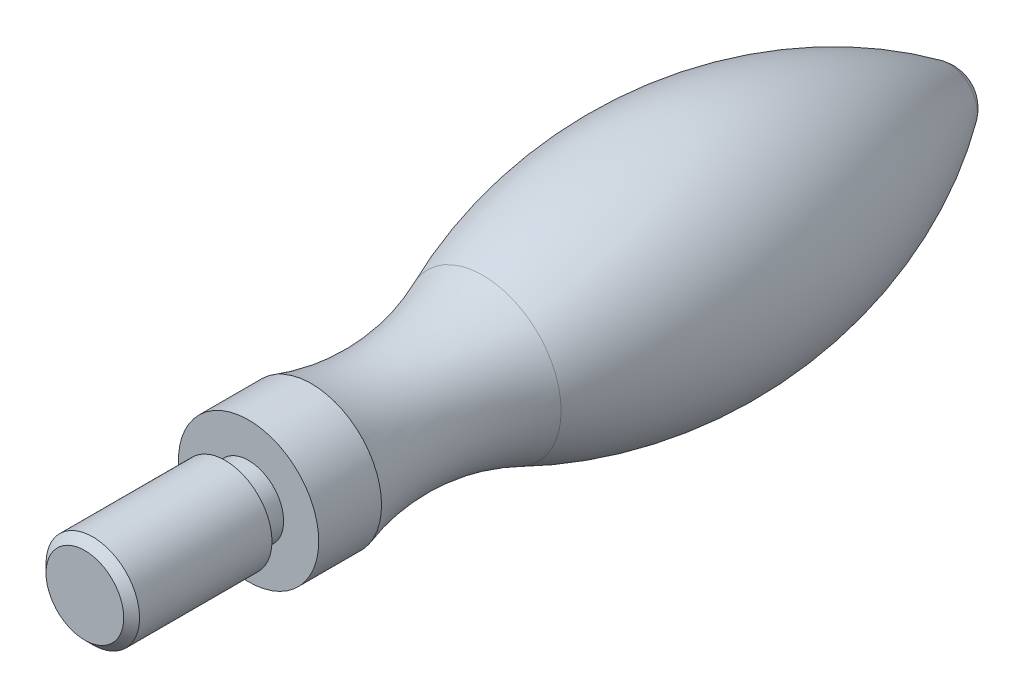
ISO-10303-21;
HEADER;
FILE_DESCRIPTION(('STEP AP214'),'2;1');
FILE_NAME('part.step','',(''),(''),'','','');
FILE_SCHEMA(('AUTOMOTIVE_DESIGN { 1 0 10303 214 1 1 1 1 }'));
ENDSEC;
DATA;
#1=APPLICATION_CONTEXT('core data for automotive mechanical design processes');
#2=APPLICATION_PROTOCOL_DEFINITION('international standard','automotive_design',2000,#1);
#3=PRODUCT_CONTEXT('',#1,'mechanical');
#4=PRODUCT('Part','Part','',(#3));
#5=PRODUCT_RELATED_PRODUCT_CATEGORY('part','',(#4));
#6=PRODUCT_DEFINITION_FORMATION('','',#4);
#7=PRODUCT_DEFINITION_CONTEXT('part definition',#1,'design');
#8=PRODUCT_DEFINITION('design','',#6,#7);
#9=PRODUCT_DEFINITION_SHAPE('','',#8);
#10=(LENGTH_UNIT() NAMED_UNIT(*) SI_UNIT(.MILLI.,.METRE.));
#11=(NAMED_UNIT(*) PLANE_ANGLE_UNIT() SI_UNIT($,.RADIAN.));
#12=(NAMED_UNIT(*) SI_UNIT($,.STERADIAN.) SOLID_ANGLE_UNIT());
#13=UNCERTAINTY_MEASURE_WITH_UNIT(LENGTH_MEASURE(1.E-05),#10,'distance_accuracy_value','');
#14=(GEOMETRIC_REPRESENTATION_CONTEXT(3) GLOBAL_UNCERTAINTY_ASSIGNED_CONTEXT((#13)) GLOBAL_UNIT_ASSIGNED_CONTEXT((#10,
#11,#12)) REPRESENTATION_CONTEXT('',''));
#15=CARTESIAN_POINT('',(0.,0.,0.));
#16=DIRECTION('',(0.,0.,1.));
#17=DIRECTION('',(1.,0.,0.));
#18=AXIS2_PLACEMENT_3D('',#15,#16,#17);
#19=CARTESIAN_POINT('',(0.,0.,-14.));
#20=DIRECTION('',(0.,0.,1.));
#21=DIRECTION('',(1.,0.,0.));
#22=AXIS2_PLACEMENT_3D('',#19,#20,#21);
#23=CYLINDRICAL_SURFACE('',#22,4.);
#24=CARTESIAN_POINT('',(0.,0.,-0.67649999999999));
#25=DIRECTION('',(0.,0.,-1.));
#26=DIRECTION('',(-1.,0.,0.));
#27=AXIS2_PLACEMENT_3D('',#24,#25,#26);
#28=CIRCLE('',#27,4.);
#29=CARTESIAN_POINT('',(-4.,0.,-0.67649999999999));
#30=VERTEX_POINT('',#29);
#31=EDGE_CURVE('E68',#30,#30,#28,.T.);
#32=ORIENTED_EDGE('',*,*,#31,.T.);
#33=EDGE_LOOP('',(#32));
#34=FACE_BOUND('',#33,.T.);
#35=CARTESIAN_POINT('',(0.,0.,-12.));
#36=DIRECTION('',(0.,0.,-1.));
#37=DIRECTION('',(-1.,0.,0.));
#38=AXIS2_PLACEMENT_3D('',#35,#36,#37);
#39=CIRCLE('',#38,4.);
#40=CARTESIAN_POINT('',(-4.,0.,-12.));
#41=VERTEX_POINT('',#40);
#42=EDGE_CURVE('E11',#41,#41,#39,.F.);
#43=ORIENTED_EDGE('',*,*,#42,.T.);
#44=EDGE_LOOP('',(#43));
#45=FACE_BOUND('',#44,.T.);
#46=ADVANCED_FACE('F50',(#34,#45),#23,.T.);
#47=CARTESIAN_POINT('',(0.,0.,-12.));
#48=DIRECTION('',(0.,0.,-1.));
#49=DIRECTION('',(-1.,0.,0.));
#50=AXIS2_PLACEMENT_3D('',#47,#48,#49);
#51=PLANE('',#50);
#52=ORIENTED_EDGE('',*,*,#42,.F.);
#53=EDGE_LOOP('',(#52));
#54=FACE_BOUND('',#53,.T.);
#55=CARTESIAN_POINT('',(0.,0.,-12.));
#56=DIRECTION('',(0.,0.,-1.));
#57=DIRECTION('',(-1.,0.,0.));
#58=AXIS2_PLACEMENT_3D('',#55,#56,#57);
#59=CIRCLE('',#58,3.);
#60=CARTESIAN_POINT('',(-3.,0.,-12.));
#61=VERTEX_POINT('',#60);
#62=EDGE_CURVE('E57',#61,#61,#59,.T.);
#63=ORIENTED_EDGE('',*,*,#62,.F.);
#64=EDGE_LOOP('',(#63));
#65=FACE_BOUND('',#64,.T.);
#66=ADVANCED_FACE('F111',(#54,#65),#51,.T.);
#67=CARTESIAN_POINT('',(0.,0.,-12.));
#68=DIRECTION('',(0.,0.,-1.));
#69=DIRECTION('',(-1.,0.,0.));
#70=AXIS2_PLACEMENT_3D('',#67,#68,#69);
#71=CYLINDRICAL_SURFACE('',#70,3.);
#72=ORIENTED_EDGE('',*,*,#62,.T.);
#73=EDGE_LOOP('',(#72));
#74=FACE_BOUND('',#73,.T.);
#75=CARTESIAN_POINT('',(0.,0.,-14.));
#76=DIRECTION('',(0.,0.,-1.));
#77=DIRECTION('',(-1.,0.,0.));
#78=AXIS2_PLACEMENT_3D('',#75,#76,#77);
#79=CIRCLE('',#78,3.);
#80=CARTESIAN_POINT('',(-3.,0.,-14.));
#81=VERTEX_POINT('',#80);
#82=EDGE_CURVE('E62',#81,#81,#79,.T.);
#83=ORIENTED_EDGE('',*,*,#82,.F.);
#84=EDGE_LOOP('',(#83));
#85=FACE_BOUND('',#84,.T.);
#86=ADVANCED_FACE('F117',(#74,#85),#71,.T.);
#87=CARTESIAN_POINT('',(0.,0.,0.));
#88=DIRECTION('',(0.,0.,-1.));
#89=DIRECTION('',(-1.,0.,0.));
#90=AXIS2_PLACEMENT_3D('',#87,#88,#89);
#91=CONICAL_SURFACE('',#90,3.3235,0.785398163397453);
#92=ORIENTED_EDGE('',*,*,#31,.F.);
#93=EDGE_LOOP('',(#92));
#94=FACE_BOUND('',#93,.T.);
#95=CARTESIAN_POINT('',(0.,0.,0.));
#96=DIRECTION('',(0.,0.,-1.));
#97=DIRECTION('',(-1.,0.,0.));
#98=AXIS2_PLACEMENT_3D('',#95,#96,#97);
#99=CIRCLE('',#98,3.3235);
#100=CARTESIAN_POINT('',(-3.3235,0.,0.));
#101=VERTEX_POINT('',#100);
#102=EDGE_CURVE('E73',#101,#101,#99,.T.);
#103=ORIENTED_EDGE('',*,*,#102,.T.);
#104=EDGE_LOOP('',(#103));
#105=FACE_BOUND('',#104,.T.);
#106=ADVANCED_FACE('F122',(#94,#105),#91,.T.);
#107=CARTESIAN_POINT('',(0.,0.,0.));
#108=DIRECTION('',(0.,0.,1.));
#109=DIRECTION('',(1.,0.,0.));
#110=AXIS2_PLACEMENT_3D('',#107,#108,#109);
#111=PLANE('',#110);
#112=ORIENTED_EDGE('',*,*,#102,.F.);
#113=EDGE_LOOP('',(#112));
#114=FACE_BOUND('',#113,.T.);
#115=ADVANCED_FACE('F124',(#114),#111,.T.);
#116=CARTESIAN_POINT('',(0.,0.,-72.1444452458384));
#117=DIRECTION('',(0.,0.,1.));
#118=DIRECTION('',(0.,1.,0.));
#119=AXIS2_PLACEMENT_3D('',#116,#117,#118);
#120=SPHERICAL_SURFACE('',#119,2.99999999999999);
#121=CARTESIAN_POINT('',(0.,0.,-73.8794921649834));
#122=DIRECTION('',(0.,0.,1.));
#123=DIRECTION('',(1.,0.,0.));
#124=AXIS2_PLACEMENT_3D('',#121,#122,#123);
#125=CIRCLE('',#124,2.44736842105263);
#126=CARTESIAN_POINT('',(2.44736842105263,0.,-73.8794921649834));
#127=VERTEX_POINT('',#126);
#128=EDGE_CURVE('E77',#127,#127,#125,.T.);
#129=ORIENTED_EDGE('',*,*,#128,.F.);
#130=EDGE_LOOP('',(#129));
#131=FACE_BOUND('',#130,.T.);
#132=ADVANCED_FACE('F129',(#131),#120,.T.);
#133=CARTESIAN_POINT('',(0.,0.,-50.1671842700025));
#134=DIRECTION('',(0.,0.,1.));
#135=DIRECTION('',(1.,0.,0.));
#136=AXIS2_PLACEMENT_3D('',#133,#134,#135);
#137=DEGENERATE_TOROIDAL_SURFACE('',#136,31.,41.,.F.);
#138=ORIENTED_EDGE('',*,*,#128,.T.);
#139=EDGE_LOOP('',(#138));
#140=FACE_BOUND('',#139,.T.);
#141=CARTESIAN_POINT('',(0.,0.,-34.0365795079487));
#142=DIRECTION('',(0.,0.,1.));
#143=DIRECTION('',(1.,0.,0.));
#144=AXIS2_PLACEMENT_3D('',#141,#142,#143);
#145=CIRCLE('',#144,6.69354838709677);
#146=CARTESIAN_POINT('',(6.69354838709677,0.,-34.0365795079487));
#147=VERTEX_POINT('',#146);
#148=EDGE_CURVE('E81',#147,#147,#145,.T.);
#149=ORIENTED_EDGE('',*,*,#148,.F.);
#150=EDGE_LOOP('',(#149));
#151=FACE_BOUND('',#150,.T.);
#152=ADVANCED_FACE('F107',(#140,#151),#137,.F.);
#153=CARTESIAN_POINT('',(0.,0.,-25.7745624347016));
#154=DIRECTION('',(0.,0.,1.));
#155=DIRECTION('',(1.,0.,0.));
#156=AXIS2_PLACEMENT_3D('',#153,#154,#155);
#157=TOROIDAL_SURFACE('',#156,26.,21.);
#158=ORIENTED_EDGE('',*,*,#148,.T.);
#159=EDGE_LOOP('',(#158));
#160=FACE_BOUND('',#159,.T.);
#161=CARTESIAN_POINT('',(0.,0.,-19.3714381972687));
#162=DIRECTION('',(0.,0.,1.));
#163=DIRECTION('',(1.,0.,0.));
#164=AXIS2_PLACEMENT_3D('',#161,#162,#163);
#165=CIRCLE('',#164,6.);
#166=CARTESIAN_POINT('',(6.,0.,-19.3714381972687));
#167=VERTEX_POINT('',#166);
#168=EDGE_CURVE('E85',#167,#167,#165,.T.);
#169=ORIENTED_EDGE('',*,*,#168,.F.);
#170=EDGE_LOOP('',(#169));
#171=FACE_BOUND('',#170,.T.);
#172=ADVANCED_FACE('F98',(#160,#171),#157,.F.);
#173=CARTESIAN_POINT('',(0.,0.,-14.));
#174=DIRECTION('',(0.,0.,1.));
#175=DIRECTION('',(1.,0.,0.));
#176=AXIS2_PLACEMENT_3D('',#173,#174,#175);
#177=CYLINDRICAL_SURFACE('',#176,6.);
#178=ORIENTED_EDGE('',*,*,#168,.T.);
#179=EDGE_LOOP('',(#178));
#180=FACE_BOUND('',#179,.T.);
#181=CARTESIAN_POINT('',(0.,0.,-14.));
#182=DIRECTION('',(0.,0.,1.));
#183=DIRECTION('',(1.,0.,0.));
#184=AXIS2_PLACEMENT_3D('',#181,#182,#183);
#185=CIRCLE('',#184,6.);
#186=CARTESIAN_POINT('',(6.,0.,-14.));
#187=VERTEX_POINT('',#186);
#188=EDGE_CURVE('E89',#187,#187,#185,.T.);
#189=ORIENTED_EDGE('',*,*,#188,.F.);
#190=EDGE_LOOP('',(#189));
#191=FACE_BOUND('',#190,.T.);
#192=ADVANCED_FACE('F96',(#180,#191),#177,.T.);
#193=CARTESIAN_POINT('',(0.,0.,-14.));
#194=DIRECTION('',(0.,0.,1.));
#195=DIRECTION('',(1.,0.,0.));
#196=AXIS2_PLACEMENT_3D('',#193,#194,#195);
#197=PLANE('',#196);
#198=ORIENTED_EDGE('',*,*,#82,.T.);
#199=EDGE_LOOP('',(#198));
#200=FACE_BOUND('',#199,.T.);
#201=ORIENTED_EDGE('',*,*,#188,.T.);
#202=EDGE_LOOP('',(#201));
#203=FACE_BOUND('',#202,.T.);
#204=ADVANCED_FACE('F94',(#200,#203),#197,.T.);
#205=CLOSED_SHELL('',(#46,#66,#86,#106,#115,#132,#152,#172,#192,#204));
#206=MANIFOLD_SOLID_BREP('B2',#205);
#207=ADVANCED_BREP_SHAPE_REPRESENTATION('',(#18,#206),#14);
#208=SHAPE_DEFINITION_REPRESENTATION(#9,#207);
ENDSEC;
END-ISO-10303-21;
